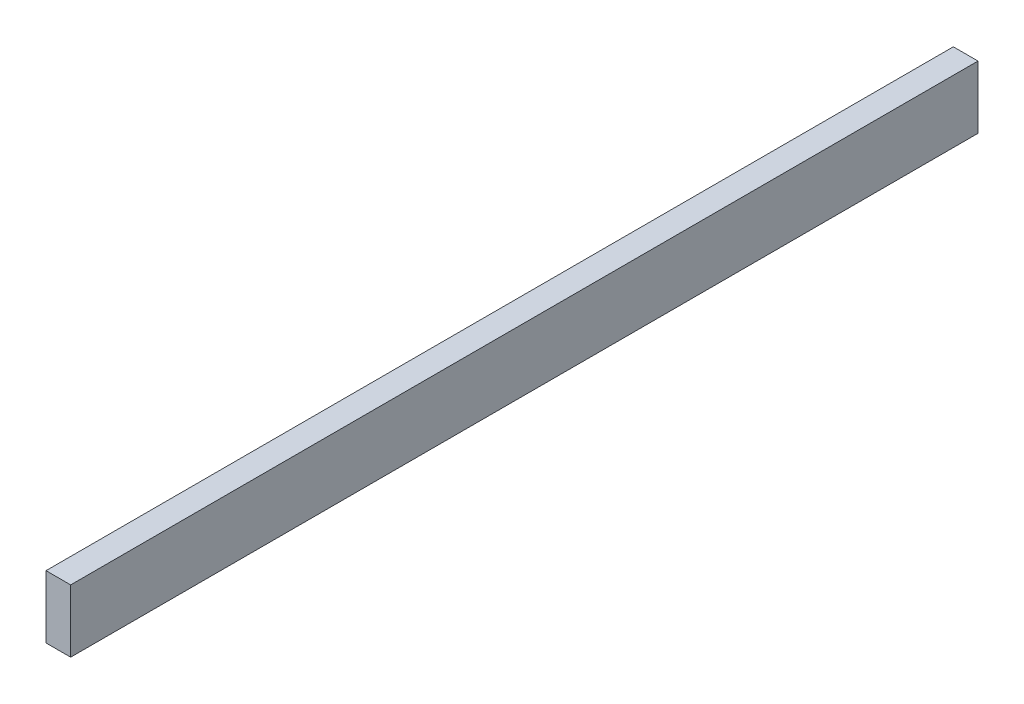
ISO-10303-21;
HEADER;
FILE_DESCRIPTION(('STEP AP214'),'2;1');
FILE_NAME('part.step','',(''),(''),'','','');
FILE_SCHEMA(('AUTOMOTIVE_DESIGN { 1 0 10303 214 1 1 1 1 }'));
ENDSEC;
DATA;
#1=APPLICATION_CONTEXT('core data for automotive mechanical design processes');
#2=APPLICATION_PROTOCOL_DEFINITION('international standard','automotive_design',2000,#1);
#3=PRODUCT_CONTEXT('',#1,'mechanical');
#4=PRODUCT('Part','Part','',(#3));
#5=PRODUCT_RELATED_PRODUCT_CATEGORY('part','',(#4));
#6=PRODUCT_DEFINITION_FORMATION('','',#4);
#7=PRODUCT_DEFINITION_CONTEXT('part definition',#1,'design');
#8=PRODUCT_DEFINITION('design','',#6,#7);
#9=PRODUCT_DEFINITION_SHAPE('','',#8);
#10=(LENGTH_UNIT() NAMED_UNIT(*) SI_UNIT(.MILLI.,.METRE.));
#11=(NAMED_UNIT(*) PLANE_ANGLE_UNIT() SI_UNIT($,.RADIAN.));
#12=(NAMED_UNIT(*) SI_UNIT($,.STERADIAN.) SOLID_ANGLE_UNIT());
#13=UNCERTAINTY_MEASURE_WITH_UNIT(LENGTH_MEASURE(1.E-05),#10,'distance_accuracy_value','');
#14=(GEOMETRIC_REPRESENTATION_CONTEXT(3) GLOBAL_UNCERTAINTY_ASSIGNED_CONTEXT((#13)) GLOBAL_UNIT_ASSIGNED_CONTEXT((#10,
#11,#12)) REPRESENTATION_CONTEXT('',''));
#15=CARTESIAN_POINT('',(0.,0.,0.));
#16=DIRECTION('',(0.,0.,1.));
#17=DIRECTION('',(1.,0.,0.));
#18=AXIS2_PLACEMENT_3D('',#15,#16,#17);
#19=CARTESIAN_POINT('',(5.,6.35,-92.));
#20=DIRECTION('',(0.,0.,1.));
#21=DIRECTION('',(0.,-1.,0.));
#22=AXIS2_PLACEMENT_3D('',#19,#20,#21);
#23=PLANE('',#22);
#24=DIRECTION('',(0.,1.,0.));
#25=VECTOR('',#24,1.);
#26=CARTESIAN_POINT('',(0.,6.35,-92.));
#27=LINE('',#26,#25);
#28=CARTESIAN_POINT('',(0.,-6.35,-92.));
#29=VERTEX_POINT('',#28);
#30=CARTESIAN_POINT('',(0.,6.35,-92.));
#31=VERTEX_POINT('',#30);
#32=EDGE_CURVE('E96',#29,#31,#27,.T.);
#33=ORIENTED_EDGE('',*,*,#32,.T.);
#34=DIRECTION('',(-1.,0.,0.));
#35=VECTOR('',#34,1.);
#36=CARTESIAN_POINT('',(5.,6.35,-92.));
#37=LINE('',#36,#35);
#38=CARTESIAN_POINT('',(5.,6.35,-92.));
#39=VERTEX_POINT('',#38);
#40=EDGE_CURVE('E11',#39,#31,#37,.T.);
#41=ORIENTED_EDGE('',*,*,#40,.F.);
#42=DIRECTION('',(0.,1.,0.));
#43=VECTOR('',#42,1.);
#44=CARTESIAN_POINT('',(5.,6.35,-92.));
#45=LINE('',#44,#43);
#46=CARTESIAN_POINT('',(5.,-6.35,-92.));
#47=VERTEX_POINT('',#46);
#48=EDGE_CURVE('E84',#47,#39,#45,.T.);
#49=ORIENTED_EDGE('',*,*,#48,.F.);
#50=DIRECTION('',(-1.,0.,0.));
#51=VECTOR('',#50,1.);
#52=CARTESIAN_POINT('',(5.,-6.35,-92.));
#53=LINE('',#52,#51);
#54=EDGE_CURVE('E92',#47,#29,#53,.T.);
#55=ORIENTED_EDGE('',*,*,#54,.T.);
#56=EDGE_LOOP('',(#33,#41,#49,#55));
#57=FACE_BOUND('',#56,.T.);
#58=ADVANCED_FACE('F33',(#57),#23,.F.);
#59=CARTESIAN_POINT('',(5.,6.35,92.));
#60=DIRECTION('',(0.,-1.,0.));
#61=DIRECTION('',(0.,0.,-1.));
#62=AXIS2_PLACEMENT_3D('',#59,#60,#61);
#63=PLANE('',#62);
#64=DIRECTION('',(0.,0.,1.));
#65=VECTOR('',#64,1.);
#66=CARTESIAN_POINT('',(0.,6.35,92.));
#67=LINE('',#66,#65);
#68=CARTESIAN_POINT('',(0.,6.35,92.));
#69=VERTEX_POINT('',#68);
#70=EDGE_CURVE('E88',#31,#69,#67,.T.);
#71=ORIENTED_EDGE('',*,*,#70,.T.);
#72=DIRECTION('',(-1.,0.,0.));
#73=VECTOR('',#72,1.);
#74=CARTESIAN_POINT('',(5.,6.35,92.));
#75=LINE('',#74,#73);
#76=CARTESIAN_POINT('',(5.,6.35,92.));
#77=VERTEX_POINT('',#76);
#78=EDGE_CURVE('E41',#77,#69,#75,.T.);
#79=ORIENTED_EDGE('',*,*,#78,.F.);
#80=DIRECTION('',(0.,0.,1.));
#81=VECTOR('',#80,1.);
#82=CARTESIAN_POINT('',(5.,6.35,92.));
#83=LINE('',#82,#81);
#84=EDGE_CURVE('E79',#39,#77,#83,.T.);
#85=ORIENTED_EDGE('',*,*,#84,.F.);
#86=ORIENTED_EDGE('',*,*,#40,.T.);
#87=EDGE_LOOP('',(#71,#79,#85,#86));
#88=FACE_BOUND('',#87,.T.);
#89=ADVANCED_FACE('F87',(#88),#63,.F.);
#90=CARTESIAN_POINT('',(5.,6.35,92.));
#91=DIRECTION('',(0.,0.,-1.));
#92=DIRECTION('',(0.,1.,0.));
#93=AXIS2_PLACEMENT_3D('',#90,#91,#92);
#94=PLANE('',#93);
#95=DIRECTION('',(0.,-1.,0.));
#96=VECTOR('',#95,1.);
#97=CARTESIAN_POINT('',(0.,6.35,92.));
#98=LINE('',#97,#96);
#99=CARTESIAN_POINT('',(0.,-6.35,92.));
#100=VERTEX_POINT('',#99);
#101=EDGE_CURVE('E66',#69,#100,#98,.T.);
#102=ORIENTED_EDGE('',*,*,#101,.T.);
#103=DIRECTION('',(-1.,0.,0.));
#104=VECTOR('',#103,1.);
#105=CARTESIAN_POINT('',(5.,-6.35,92.));
#106=LINE('',#105,#104);
#107=CARTESIAN_POINT('',(5.,-6.35,92.));
#108=VERTEX_POINT('',#107);
#109=EDGE_CURVE('E89',#108,#100,#106,.T.);
#110=ORIENTED_EDGE('',*,*,#109,.F.);
#111=DIRECTION('',(0.,-1.,0.));
#112=VECTOR('',#111,1.);
#113=CARTESIAN_POINT('',(5.,6.35,92.));
#114=LINE('',#113,#112);
#115=EDGE_CURVE('E82',#77,#108,#114,.T.);
#116=ORIENTED_EDGE('',*,*,#115,.F.);
#117=ORIENTED_EDGE('',*,*,#78,.T.);
#118=EDGE_LOOP('',(#102,#110,#116,#117));
#119=FACE_BOUND('',#118,.T.);
#120=ADVANCED_FACE('F90',(#119),#94,.F.);
#121=CARTESIAN_POINT('',(5.,-6.35,92.));
#122=DIRECTION('',(0.,1.,0.));
#123=DIRECTION('',(0.,0.,1.));
#124=AXIS2_PLACEMENT_3D('',#121,#122,#123);
#125=PLANE('',#124);
#126=DIRECTION('',(0.,0.,-1.));
#127=VECTOR('',#126,1.);
#128=CARTESIAN_POINT('',(0.,-6.35,92.));
#129=LINE('',#128,#127);
#130=EDGE_CURVE('E72',#100,#29,#129,.T.);
#131=ORIENTED_EDGE('',*,*,#130,.T.);
#132=ORIENTED_EDGE('',*,*,#54,.F.);
#133=DIRECTION('',(0.,0.,-1.));
#134=VECTOR('',#133,1.);
#135=CARTESIAN_POINT('',(5.,-6.35,92.));
#136=LINE('',#135,#134);
#137=EDGE_CURVE('E49',#108,#47,#136,.T.);
#138=ORIENTED_EDGE('',*,*,#137,.F.);
#139=ORIENTED_EDGE('',*,*,#109,.T.);
#140=EDGE_LOOP('',(#131,#132,#138,#139));
#141=FACE_BOUND('',#140,.T.);
#142=ADVANCED_FACE('F103',(#141),#125,.F.);
#143=CARTESIAN_POINT('',(5.,0.,0.));
#144=DIRECTION('',(1.,0.,0.));
#145=DIRECTION('',(0.,0.,-1.));
#146=AXIS2_PLACEMENT_3D('',#143,#144,#145);
#147=PLANE('',#146);
#148=ORIENTED_EDGE('',*,*,#48,.T.);
#149=ORIENTED_EDGE('',*,*,#84,.T.);
#150=ORIENTED_EDGE('',*,*,#115,.T.);
#151=ORIENTED_EDGE('',*,*,#137,.T.);
#152=EDGE_LOOP('',(#148,#149,#150,#151));
#153=FACE_BOUND('',#152,.T.);
#154=ADVANCED_FACE('F80',(#153),#147,.T.);
#155=CARTESIAN_POINT('',(0.,0.,0.));
#156=DIRECTION('',(1.,0.,0.));
#157=DIRECTION('',(0.,0.,-1.));
#158=AXIS2_PLACEMENT_3D('',#155,#156,#157);
#159=PLANE('',#158);
#160=ORIENTED_EDGE('',*,*,#32,.F.);
#161=ORIENTED_EDGE('',*,*,#130,.F.);
#162=ORIENTED_EDGE('',*,*,#101,.F.);
#163=ORIENTED_EDGE('',*,*,#70,.F.);
#164=EDGE_LOOP('',(#160,#161,#162,#163));
#165=FACE_BOUND('',#164,.T.);
#166=ADVANCED_FACE('F106',(#165),#159,.F.);
#167=CLOSED_SHELL('',(#58,#89,#120,#142,#154,#166));
#168=MANIFOLD_SOLID_BREP('B2',#167);
#169=ADVANCED_BREP_SHAPE_REPRESENTATION('',(#18,#168),#14);
#170=SHAPE_DEFINITION_REPRESENTATION(#9,#169);
ENDSEC;
END-ISO-10303-21;
